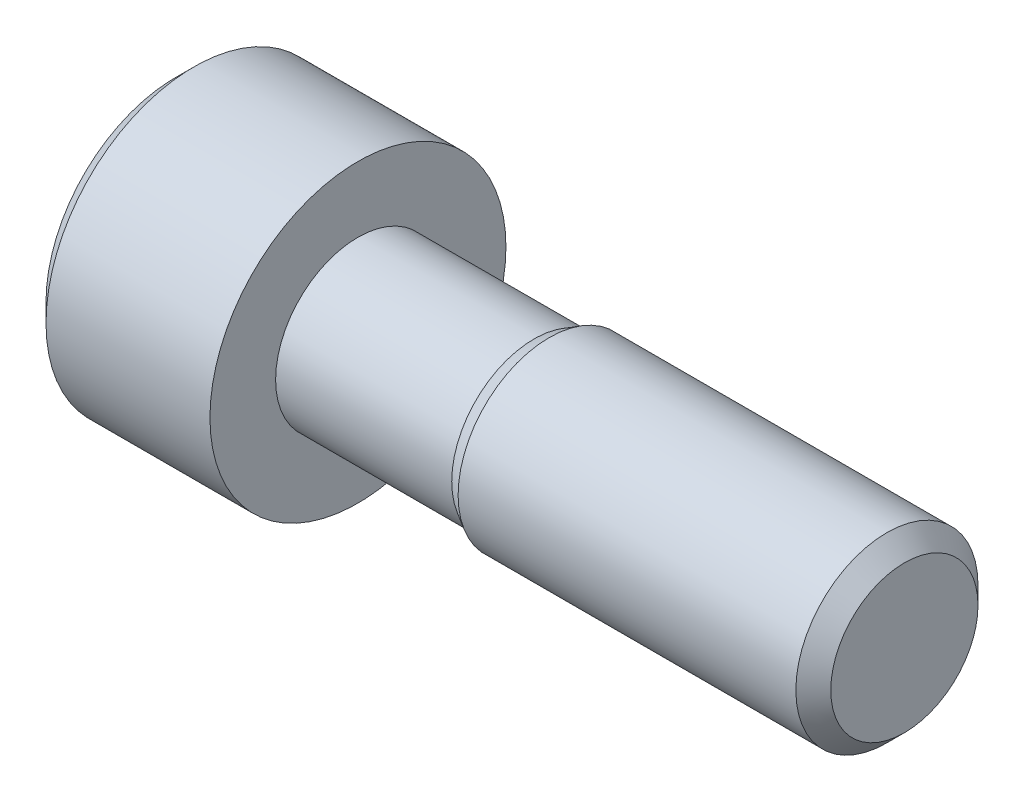
ISO-10303-21;
HEADER;
FILE_DESCRIPTION(('STEP AP214'),'2;1');
FILE_NAME('part.step','',(''),(''),'','','');
FILE_SCHEMA(('AUTOMOTIVE_DESIGN { 1 0 10303 214 1 1 1 1 }'));
ENDSEC;
DATA;
#1=APPLICATION_CONTEXT('core data for automotive mechanical design processes');
#2=APPLICATION_PROTOCOL_DEFINITION('international standard','automotive_design',2000,#1);
#3=PRODUCT_CONTEXT('',#1,'mechanical');
#4=PRODUCT('Part','Part','',(#3));
#5=PRODUCT_RELATED_PRODUCT_CATEGORY('part','',(#4));
#6=PRODUCT_DEFINITION_FORMATION('','',#4);
#7=PRODUCT_DEFINITION_CONTEXT('part definition',#1,'design');
#8=PRODUCT_DEFINITION('design','',#6,#7);
#9=PRODUCT_DEFINITION_SHAPE('','',#8);
#10=(LENGTH_UNIT() NAMED_UNIT(*) SI_UNIT(.MILLI.,.METRE.));
#11=(NAMED_UNIT(*) PLANE_ANGLE_UNIT() SI_UNIT($,.RADIAN.));
#12=(NAMED_UNIT(*) SI_UNIT($,.STERADIAN.) SOLID_ANGLE_UNIT());
#13=UNCERTAINTY_MEASURE_WITH_UNIT(LENGTH_MEASURE(1.E-05),#10,'distance_accuracy_value','');
#14=(GEOMETRIC_REPRESENTATION_CONTEXT(3) GLOBAL_UNCERTAINTY_ASSIGNED_CONTEXT((#13)) GLOBAL_UNIT_ASSIGNED_CONTEXT((#10,
#11,#12)) REPRESENTATION_CONTEXT('',''));
#15=CARTESIAN_POINT('',(0.,0.,0.));
#16=DIRECTION('',(0.,0.,1.));
#17=DIRECTION('',(1.,0.,0.));
#18=AXIS2_PLACEMENT_3D('',#15,#16,#17);
#19=CARTESIAN_POINT('',(-8.,-5.7,5.7));
#20=DIRECTION('',(-1.,0.,0.));
#21=DIRECTION('',(0.,1.,0.));
#22=AXIS2_PLACEMENT_3D('',#19,#20,#21);
#23=PLANE('',#22);
#24=CARTESIAN_POINT('',(-8.,0.,0.));
#25=DIRECTION('',(-1.,0.,0.));
#26=DIRECTION('',(0.,0.,-1.));
#27=AXIS2_PLACEMENT_3D('',#24,#25,#26);
#28=CIRCLE('',#27,5.7);
#29=CARTESIAN_POINT('',(-8.,0.,-5.7));
#30=VERTEX_POINT('',#29);
#31=EDGE_CURVE('E111',#30,#30,#28,.F.);
#32=ORIENTED_EDGE('',*,*,#31,.F.);
#33=EDGE_LOOP('',(#32));
#34=FACE_BOUND('',#33,.T.);
#35=DIRECTION('',(0.,0.500000000000001,-0.866025403784438));
#36=VECTOR('',#35,1.);
#37=CARTESIAN_POINT('',(-8.,-3.46410161513779,0.));
#38=LINE('',#37,#36);
#39=CARTESIAN_POINT('',(-8.,-1.7320508075689,-3.));
#40=VERTEX_POINT('',#39);
#41=CARTESIAN_POINT('',(-8.,-3.46410161513779,0.));
#42=VERTEX_POINT('',#41);
#43=EDGE_CURVE('E98',#40,#42,#38,.F.);
#44=ORIENTED_EDGE('',*,*,#43,.F.);
#45=DIRECTION('',(0.,1.,0.));
#46=VECTOR('',#45,1.);
#47=CARTESIAN_POINT('',(-8.,-1.7320508075689,-3.));
#48=LINE('',#47,#46);
#49=CARTESIAN_POINT('',(-8.,1.7320508075689,-3.));
#50=VERTEX_POINT('',#49);
#51=EDGE_CURVE('E87',#50,#40,#48,.F.);
#52=ORIENTED_EDGE('',*,*,#51,.F.);
#53=DIRECTION('',(0.,0.500000000000006,0.866025403784435));
#54=VECTOR('',#53,1.);
#55=CARTESIAN_POINT('',(-8.,1.7320508075689,-3.));
#56=LINE('',#55,#54);
#57=CARTESIAN_POINT('',(-8.,3.4641016151378,0.));
#58=VERTEX_POINT('',#57);
#59=EDGE_CURVE('E97',#58,#50,#56,.F.);
#60=ORIENTED_EDGE('',*,*,#59,.F.);
#61=DIRECTION('',(0.,-0.500000000000005,0.866025403784436));
#62=VECTOR('',#61,1.);
#63=CARTESIAN_POINT('',(-8.,3.4641016151378,0.));
#64=LINE('',#63,#62);
#65=CARTESIAN_POINT('',(-8.,1.7320508075689,3.));
#66=VERTEX_POINT('',#65);
#67=EDGE_CURVE('E121',#66,#58,#64,.F.);
#68=ORIENTED_EDGE('',*,*,#67,.F.);
#69=DIRECTION('',(0.,-1.,0.));
#70=VECTOR('',#69,1.);
#71=CARTESIAN_POINT('',(-8.,1.7320508075689,3.));
#72=LINE('',#71,#70);
#73=CARTESIAN_POINT('',(-8.,-1.7320508075689,3.));
#74=VERTEX_POINT('',#73);
#75=EDGE_CURVE('E125',#74,#66,#72,.F.);
#76=ORIENTED_EDGE('',*,*,#75,.F.);
#77=DIRECTION('',(0.,-0.500000000000001,-0.866025403784438));
#78=VECTOR('',#77,1.);
#79=CARTESIAN_POINT('',(-8.,-1.7320508075689,3.));
#80=LINE('',#79,#78);
#81=EDGE_CURVE('E110',#42,#74,#80,.F.);
#82=ORIENTED_EDGE('',*,*,#81,.F.);
#83=EDGE_LOOP('',(#44,#52,#60,#68,#76,#82));
#84=FACE_BOUND('',#83,.T.);
#85=ADVANCED_FACE('F17',(#34,#84),#23,.T.);
#86=CARTESIAN_POINT('',(24.,-3.233,-3.233));
#87=DIRECTION('',(1.,0.,0.));
#88=DIRECTION('',(0.,1.,0.));
#89=AXIS2_PLACEMENT_3D('',#86,#87,#88);
#90=PLANE('',#89);
#91=CARTESIAN_POINT('',(24.,0.,0.));
#92=DIRECTION('',(1.,0.,0.));
#93=DIRECTION('',(0.,0.,1.));
#94=AXIS2_PLACEMENT_3D('',#91,#92,#93);
#95=CIRCLE('',#94,3.233);
#96=CARTESIAN_POINT('',(24.,0.,3.233));
#97=VERTEX_POINT('',#96);
#98=EDGE_CURVE('E133',#97,#97,#95,.T.);
#99=ORIENTED_EDGE('',*,*,#98,.T.);
#100=EDGE_LOOP('',(#99));
#101=FACE_BOUND('',#100,.T.);
#102=ADVANCED_FACE('F285',(#101),#90,.T.);
#103=CARTESIAN_POINT('',(0.,-6.67760572478225,-6.5));
#104=DIRECTION('',(1.,0.,0.));
#105=DIRECTION('',(0.,1.,0.));
#106=AXIS2_PLACEMENT_3D('',#103,#104,#105);
#107=PLANE('',#106);
#108=CARTESIAN_POINT('',(0.,0.,0.));
#109=DIRECTION('',(1.,0.,0.));
#110=DIRECTION('',(0.,0.,1.));
#111=AXIS2_PLACEMENT_3D('',#108,#109,#110);
#112=CIRCLE('',#111,6.5);
#113=CARTESIAN_POINT('',(0.,0.,6.5));
#114=VERTEX_POINT('',#113);
#115=EDGE_CURVE('E138',#114,#114,#112,.T.);
#116=ORIENTED_EDGE('',*,*,#115,.T.);
#117=EDGE_LOOP('',(#116));
#118=FACE_BOUND('',#117,.T.);
#119=CARTESIAN_POINT('',(0.,0.,0.));
#120=DIRECTION('',(-1.,0.,0.));
#121=DIRECTION('',(0.,0.,-1.));
#122=AXIS2_PLACEMENT_3D('',#119,#120,#121);
#123=CIRCLE('',#122,3.61604075);
#124=CARTESIAN_POINT('',(0.,0.,-3.61604075));
#125=VERTEX_POINT('',#124);
#126=EDGE_CURVE('E141',#125,#125,#123,.F.);
#127=ORIENTED_EDGE('',*,*,#126,.F.);
#128=EDGE_LOOP('',(#127));
#129=FACE_BOUND('',#128,.T.);
#130=ADVANCED_FACE('F291',(#118,#129),#107,.T.);
#131=CARTESIAN_POINT('',(-4.,-2.59807621135334,-1.50000000000001));
#132=DIRECTION('',(-1.,0.,0.));
#133=DIRECTION('',(0.,1.,0.));
#134=AXIS2_PLACEMENT_3D('',#131,#132,#133);
#135=PLANE('',#134);
#136=DIRECTION('',(0.,-1.,0.));
#137=VECTOR('',#136,1.);
#138=CARTESIAN_POINT('',(-4.,0.,-3.));
#139=LINE('',#138,#137);
#140=CARTESIAN_POINT('',(-4.,-1.7320508075689,-3.));
#141=VERTEX_POINT('',#140);
#142=CARTESIAN_POINT('',(-4.,0.,-3.));
#143=VERTEX_POINT('',#142);
#144=EDGE_CURVE('E144',#141,#143,#139,.F.);
#145=ORIENTED_EDGE('',*,*,#144,.F.);
#146=DIRECTION('',(0.,-0.500000000000004,0.866025403784437));
#147=VECTOR('',#146,1.);
#148=CARTESIAN_POINT('',(-4.,-1.7320508075689,-3.));
#149=LINE('',#148,#147);
#150=CARTESIAN_POINT('',(-4.,-2.59807621135333,-1.50000000000003));
#151=VERTEX_POINT('',#150);
#152=EDGE_CURVE('E105',#151,#141,#149,.F.);
#153=ORIENTED_EDGE('',*,*,#152,.F.);
#154=CARTESIAN_POINT('',(-4.,0.,0.));
#155=DIRECTION('',(1.,0.,0.));
#156=DIRECTION('',(0.,-0.866025403784436,-0.500000000000005));
#157=AXIS2_PLACEMENT_3D('',#154,#155,#156);
#158=CIRCLE('',#157,3.00000000000004);
#159=EDGE_CURVE('E149',#151,#143,#158,.T.);
#160=ORIENTED_EDGE('',*,*,#159,.T.);
#161=EDGE_LOOP('',(#145,#153,#160));
#162=FACE_BOUND('',#161,.T.);
#163=ADVANCED_FACE('F298',(#162),#135,.T.);
#164=CARTESIAN_POINT('',(-4.,-3.4641016151378,1.50000000000002));
#165=DIRECTION('',(-1.,0.,0.));
#166=DIRECTION('',(0.,1.,0.));
#167=AXIS2_PLACEMENT_3D('',#164,#165,#166);
#168=PLANE('',#167);
#169=DIRECTION('',(0.,-0.500000000000003,0.866025403784437));
#170=VECTOR('',#169,1.);
#171=CARTESIAN_POINT('',(-4.,-2.59807621135333,-1.50000000000003));
#172=LINE('',#171,#170);
#173=CARTESIAN_POINT('',(-4.,-3.4641016151378,0.));
#174=VERTEX_POINT('',#173);
#175=EDGE_CURVE('E154',#174,#151,#172,.F.);
#176=ORIENTED_EDGE('',*,*,#175,.F.);
#177=DIRECTION('',(0.,0.500000000000009,0.866025403784433));
#178=VECTOR('',#177,1.);
#179=CARTESIAN_POINT('',(-4.,-3.4641016151378,0.));
#180=LINE('',#179,#178);
#181=CARTESIAN_POINT('',(-4.,-2.59807621135332,1.50000000000002));
#182=VERTEX_POINT('',#181);
#183=EDGE_CURVE('E158',#182,#174,#180,.F.);
#184=ORIENTED_EDGE('',*,*,#183,.F.);
#185=CARTESIAN_POINT('',(-4.,0.,0.));
#186=DIRECTION('',(1.,0.,0.));
#187=DIRECTION('',(0.,-0.866025403784436,0.500000000000005));
#188=AXIS2_PLACEMENT_3D('',#185,#186,#187);
#189=CIRCLE('',#188,3.00000000000004);
#190=EDGE_CURVE('E163',#182,#151,#189,.T.);
#191=ORIENTED_EDGE('',*,*,#190,.T.);
#192=EDGE_LOOP('',(#176,#184,#191));
#193=FACE_BOUND('',#192,.T.);
#194=ADVANCED_FACE('F302',(#193),#168,.T.);
#195=CARTESIAN_POINT('',(-4.,-2.59807621135332,3.));
#196=DIRECTION('',(-1.,0.,0.));
#197=DIRECTION('',(0.,1.,0.));
#198=AXIS2_PLACEMENT_3D('',#195,#196,#197);
#199=PLANE('',#198);
#200=DIRECTION('',(0.,0.5,0.866025403784439));
#201=VECTOR('',#200,1.);
#202=CARTESIAN_POINT('',(-4.,-2.59807621135332,1.50000000000002));
#203=LINE('',#202,#201);
#204=CARTESIAN_POINT('',(-4.,-1.7320508075689,3.));
#205=VERTEX_POINT('',#204);
#206=EDGE_CURVE('E168',#205,#182,#203,.F.);
#207=ORIENTED_EDGE('',*,*,#206,.F.);
#208=DIRECTION('',(0.,1.,0.));
#209=VECTOR('',#208,1.);
#210=CARTESIAN_POINT('',(-4.,-1.7320508075689,3.));
#211=LINE('',#210,#209);
#212=CARTESIAN_POINT('',(-4.,0.,3.));
#213=VERTEX_POINT('',#212);
#214=EDGE_CURVE('E172',#213,#205,#211,.F.);
#215=ORIENTED_EDGE('',*,*,#214,.F.);
#216=CARTESIAN_POINT('',(-4.,0.,0.));
#217=DIRECTION('',(1.,0.,0.));
#218=DIRECTION('',(0.,0.,1.));
#219=AXIS2_PLACEMENT_3D('',#216,#217,#218);
#220=CIRCLE('',#219,3.00000000000004);
#221=EDGE_CURVE('E177',#213,#182,#220,.T.);
#222=ORIENTED_EDGE('',*,*,#221,.T.);
#223=EDGE_LOOP('',(#207,#215,#222));
#224=FACE_BOUND('',#223,.T.);
#225=ADVANCED_FACE('F306',(#224),#199,.T.);
#226=CARTESIAN_POINT('',(-4.,0.,3.));
#227=DIRECTION('',(-1.,0.,0.));
#228=DIRECTION('',(0.,1.,0.));
#229=AXIS2_PLACEMENT_3D('',#226,#227,#228);
#230=PLANE('',#229);
#231=DIRECTION('',(0.,1.,0.));
#232=VECTOR('',#231,1.);
#233=CARTESIAN_POINT('',(-4.,0.,3.));
#234=LINE('',#233,#232);
#235=CARTESIAN_POINT('',(-4.,1.7320508075689,3.));
#236=VERTEX_POINT('',#235);
#237=EDGE_CURVE('E182',#236,#213,#234,.F.);
#238=ORIENTED_EDGE('',*,*,#237,.F.);
#239=DIRECTION('',(0.,0.500000000000004,-0.866025403784437));
#240=VECTOR('',#239,1.);
#241=CARTESIAN_POINT('',(-4.,1.7320508075689,3.));
#242=LINE('',#241,#240);
#243=CARTESIAN_POINT('',(-4.,2.59807621135333,1.50000000000003));
#244=VERTEX_POINT('',#243);
#245=EDGE_CURVE('E186',#244,#236,#242,.F.);
#246=ORIENTED_EDGE('',*,*,#245,.F.);
#247=CARTESIAN_POINT('',(-4.,0.,0.));
#248=DIRECTION('',(1.,0.,0.));
#249=DIRECTION('',(0.,0.866025403784436,0.500000000000005));
#250=AXIS2_PLACEMENT_3D('',#247,#248,#249);
#251=CIRCLE('',#250,3.00000000000004);
#252=EDGE_CURVE('E190',#244,#213,#251,.T.);
#253=ORIENTED_EDGE('',*,*,#252,.T.);
#254=EDGE_LOOP('',(#238,#246,#253));
#255=FACE_BOUND('',#254,.T.);
#256=ADVANCED_FACE('F310',(#255),#230,.T.);
#257=CARTESIAN_POINT('',(-4.,2.59807621135331,1.50000000000003));
#258=DIRECTION('',(-1.,0.,0.));
#259=DIRECTION('',(0.,1.,0.));
#260=AXIS2_PLACEMENT_3D('',#257,#258,#259);
#261=PLANE('',#260);
#262=DIRECTION('',(0.,0.500000000000003,-0.866025403784437));
#263=VECTOR('',#262,1.);
#264=CARTESIAN_POINT('',(-4.,2.59807621135333,1.50000000000003));
#265=LINE('',#264,#263);
#266=CARTESIAN_POINT('',(-4.,3.4641016151378,0.));
#267=VERTEX_POINT('',#266);
#268=EDGE_CURVE('E195',#267,#244,#265,.F.);
#269=ORIENTED_EDGE('',*,*,#268,.F.);
#270=DIRECTION('',(0.,-0.500000000000009,-0.866025403784433));
#271=VECTOR('',#270,1.);
#272=CARTESIAN_POINT('',(-4.,3.4641016151378,0.));
#273=LINE('',#272,#271);
#274=CARTESIAN_POINT('',(-4.,2.59807621135332,-1.50000000000002));
#275=VERTEX_POINT('',#274);
#276=EDGE_CURVE('E199',#275,#267,#273,.F.);
#277=ORIENTED_EDGE('',*,*,#276,.F.);
#278=CARTESIAN_POINT('',(-4.,0.,0.));
#279=DIRECTION('',(1.,0.,0.));
#280=DIRECTION('',(0.,0.866025403784436,-0.500000000000005));
#281=AXIS2_PLACEMENT_3D('',#278,#279,#280);
#282=CIRCLE('',#281,3.00000000000004);
#283=EDGE_CURVE('E204',#275,#244,#282,.T.);
#284=ORIENTED_EDGE('',*,*,#283,.T.);
#285=EDGE_LOOP('',(#269,#277,#284));
#286=FACE_BOUND('',#285,.T.);
#287=ADVANCED_FACE('F314',(#286),#261,.T.);
#288=CARTESIAN_POINT('',(-4.,0.,-1.50000000000002));
#289=DIRECTION('',(-1.,0.,0.));
#290=DIRECTION('',(0.,1.,0.));
#291=AXIS2_PLACEMENT_3D('',#288,#289,#290);
#292=PLANE('',#291);
#293=DIRECTION('',(0.,-0.5,-0.866025403784439));
#294=VECTOR('',#293,1.);
#295=CARTESIAN_POINT('',(-4.,2.59807621135333,-1.50000000000002));
#296=LINE('',#295,#294);
#297=CARTESIAN_POINT('',(-4.,1.7320508075689,-3.));
#298=VERTEX_POINT('',#297);
#299=EDGE_CURVE('E209',#298,#275,#296,.F.);
#300=ORIENTED_EDGE('',*,*,#299,.F.);
#301=DIRECTION('',(0.,-1.,0.));
#302=VECTOR('',#301,1.);
#303=CARTESIAN_POINT('',(-4.,1.7320508075689,-3.));
#304=LINE('',#303,#302);
#305=EDGE_CURVE('E213',#143,#298,#304,.F.);
#306=ORIENTED_EDGE('',*,*,#305,.F.);
#307=CARTESIAN_POINT('',(-4.,0.,0.));
#308=DIRECTION('',(1.,0.,0.));
#309=DIRECTION('',(0.,0.,-1.));
#310=AXIS2_PLACEMENT_3D('',#307,#308,#309);
#311=CIRCLE('',#310,3.00000000000004);
#312=EDGE_CURVE('E217',#143,#275,#311,.T.);
#313=ORIENTED_EDGE('',*,*,#312,.T.);
#314=EDGE_LOOP('',(#300,#306,#313));
#315=FACE_BOUND('',#314,.T.);
#316=ADVANCED_FACE('F318',(#315),#292,.T.);
#317=CARTESIAN_POINT('',(-4.,-1.7320508075689,3.));
#318=DIRECTION('',(0.,0.,-1.));
#319=DIRECTION('',(-1.,0.,0.));
#320=AXIS2_PLACEMENT_3D('',#317,#318,#319);
#321=PLANE('',#320);
#322=ORIENTED_EDGE('',*,*,#237,.T.);
#323=ORIENTED_EDGE('',*,*,#214,.T.);
#324=DIRECTION('',(-1.,0.,0.));
#325=VECTOR('',#324,1.);
#326=CARTESIAN_POINT('',(-4.,-1.7320508075689,3.));
#327=LINE('',#326,#325);
#328=EDGE_CURVE('E222',#205,#74,#327,.T.);
#329=ORIENTED_EDGE('',*,*,#328,.T.);
#330=ORIENTED_EDGE('',*,*,#75,.T.);
#331=DIRECTION('',(1.,0.,0.));
#332=VECTOR('',#331,1.);
#333=CARTESIAN_POINT('',(-8.,1.73205080756891,3.));
#334=LINE('',#333,#332);
#335=EDGE_CURVE('E227',#236,#66,#334,.F.);
#336=ORIENTED_EDGE('',*,*,#335,.F.);
#337=EDGE_LOOP('',(#322,#323,#329,#330,#336));
#338=FACE_BOUND('',#337,.T.);
#339=ADVANCED_FACE('F322',(#338),#321,.T.);
#340=CARTESIAN_POINT('',(-8.,-3.46410161513779,0.));
#341=DIRECTION('',(0.,0.866025403784438,-0.500000000000001));
#342=DIRECTION('',(0.,0.500000000000001,0.866025403784438));
#343=AXIS2_PLACEMENT_3D('',#340,#341,#342);
#344=PLANE('',#343);
#345=ORIENTED_EDGE('',*,*,#206,.T.);
#346=ORIENTED_EDGE('',*,*,#183,.T.);
#347=DIRECTION('',(-1.,0.,0.));
#348=VECTOR('',#347,1.);
#349=CARTESIAN_POINT('',(-4.,-3.46410161513779,0.));
#350=LINE('',#349,#348);
#351=EDGE_CURVE('E106',#174,#42,#350,.T.);
#352=ORIENTED_EDGE('',*,*,#351,.T.);
#353=ORIENTED_EDGE('',*,*,#81,.T.);
#354=ORIENTED_EDGE('',*,*,#328,.F.);
#355=EDGE_LOOP('',(#345,#346,#352,#353,#354));
#356=FACE_BOUND('',#355,.T.);
#357=ADVANCED_FACE('F326',(#356),#344,.T.);
#358=CARTESIAN_POINT('',(-8.,-1.73205080756891,-3.00000000000001));
#359=DIRECTION('',(0.,0.866025403784438,0.500000000000001));
#360=DIRECTION('',(0.,-0.500000000000001,0.866025403784438));
#361=AXIS2_PLACEMENT_3D('',#358,#359,#360);
#362=PLANE('',#361);
#363=ORIENTED_EDGE('',*,*,#175,.T.);
#364=ORIENTED_EDGE('',*,*,#152,.T.);
#365=DIRECTION('',(-1.,0.,0.));
#366=VECTOR('',#365,1.);
#367=CARTESIAN_POINT('',(-4.,-1.73205080756891,-3.00000000000001));
#368=LINE('',#367,#366);
#369=EDGE_CURVE('E91',#141,#40,#368,.T.);
#370=ORIENTED_EDGE('',*,*,#369,.T.);
#371=ORIENTED_EDGE('',*,*,#43,.T.);
#372=ORIENTED_EDGE('',*,*,#351,.F.);
#373=EDGE_LOOP('',(#363,#364,#370,#371,#372));
#374=FACE_BOUND('',#373,.T.);
#375=ADVANCED_FACE('F102',(#374),#362,.T.);
#376=CARTESIAN_POINT('',(-8.,-1.7320508075689,-3.));
#377=DIRECTION('',(0.,0.,1.));
#378=DIRECTION('',(1.,0.,0.));
#379=AXIS2_PLACEMENT_3D('',#376,#377,#378);
#380=PLANE('',#379);
#381=ORIENTED_EDGE('',*,*,#144,.T.);
#382=ORIENTED_EDGE('',*,*,#305,.T.);
#383=DIRECTION('',(-1.,0.,0.));
#384=VECTOR('',#383,1.);
#385=CARTESIAN_POINT('',(-4.,1.7320508075689,-3.));
#386=LINE('',#385,#384);
#387=EDGE_CURVE('E35',#298,#50,#386,.T.);
#388=ORIENTED_EDGE('',*,*,#387,.T.);
#389=ORIENTED_EDGE('',*,*,#51,.T.);
#390=ORIENTED_EDGE('',*,*,#369,.F.);
#391=EDGE_LOOP('',(#381,#382,#388,#389,#390));
#392=FACE_BOUND('',#391,.T.);
#393=ADVANCED_FACE('F90',(#392),#380,.T.);
#394=CARTESIAN_POINT('',(-8.,3.46410161513779,0.));
#395=DIRECTION('',(0.,-0.866025403784438,0.500000000000001));
#396=DIRECTION('',(0.,-0.500000000000001,-0.866025403784438));
#397=AXIS2_PLACEMENT_3D('',#394,#395,#396);
#398=PLANE('',#397);
#399=ORIENTED_EDGE('',*,*,#299,.T.);
#400=ORIENTED_EDGE('',*,*,#276,.T.);
#401=DIRECTION('',(-1.,0.,0.));
#402=VECTOR('',#401,1.);
#403=CARTESIAN_POINT('',(-4.,3.46410161513779,0.));
#404=LINE('',#403,#402);
#405=EDGE_CURVE('E239',#267,#58,#404,.T.);
#406=ORIENTED_EDGE('',*,*,#405,.T.);
#407=ORIENTED_EDGE('',*,*,#59,.T.);
#408=ORIENTED_EDGE('',*,*,#387,.F.);
#409=EDGE_LOOP('',(#399,#400,#406,#407,#408));
#410=FACE_BOUND('',#409,.T.);
#411=ADVANCED_FACE('F335',(#410),#398,.T.);
#412=CARTESIAN_POINT('',(-8.,1.73205080756891,3.00000000000001));
#413=DIRECTION('',(0.,-0.866025403784438,-0.500000000000001));
#414=DIRECTION('',(0.,0.500000000000001,-0.866025403784438));
#415=AXIS2_PLACEMENT_3D('',#412,#413,#414);
#416=PLANE('',#415);
#417=ORIENTED_EDGE('',*,*,#268,.T.);
#418=ORIENTED_EDGE('',*,*,#245,.T.);
#419=ORIENTED_EDGE('',*,*,#335,.T.);
#420=ORIENTED_EDGE('',*,*,#67,.T.);
#421=ORIENTED_EDGE('',*,*,#405,.F.);
#422=EDGE_LOOP('',(#417,#418,#419,#420,#421));
#423=FACE_BOUND('',#422,.T.);
#424=ADVANCED_FACE('F265',(#423),#416,.T.);
#425=CARTESIAN_POINT('',(8.4,0.,0.));
#426=DIRECTION('',(1.,0.,0.));
#427=DIRECTION('',(0.,1.92328497912594E-10,1.));
#428=AXIS2_PLACEMENT_3D('',#425,#426,#427);
#429=CONICAL_SURFACE('',#428,4.,0.523598775598308);
#430=CARTESIAN_POINT('',(8.4,0.,0.));
#431=DIRECTION('',(-1.,0.,0.));
#432=DIRECTION('',(0.,0.,-1.));
#433=AXIS2_PLACEMENT_3D('',#430,#431,#432);
#434=CIRCLE('',#433,4.);
#435=CARTESIAN_POINT('',(8.4,0.,-4.));
#436=VERTEX_POINT('',#435);
#437=EDGE_CURVE('E244',#436,#436,#434,.F.);
#438=ORIENTED_EDGE('',*,*,#437,.F.);
#439=EDGE_LOOP('',(#438));
#440=FACE_BOUND('',#439,.T.);
#441=CARTESIAN_POINT('',(7.73496307096397,0.,0.));
#442=DIRECTION('',(1.,0.,0.));
#443=DIRECTION('',(0.,0.,1.));
#444=AXIS2_PLACEMENT_3D('',#441,#442,#443);
#445=CIRCLE('',#444,3.61604075);
#446=CARTESIAN_POINT('',(7.73496307096397,0.,3.61604075));
#447=VERTEX_POINT('',#446);
#448=EDGE_CURVE('E249',#447,#447,#445,.F.);
#449=ORIENTED_EDGE('',*,*,#448,.F.);
#450=EDGE_LOOP('',(#449));
#451=FACE_BOUND('',#450,.T.);
#452=ADVANCED_FACE('F259',(#440,#451),#429,.T.);
#453=CARTESIAN_POINT('',(24.,0.,0.));
#454=DIRECTION('',(1.,0.,0.));
#455=DIRECTION('',(0.,7.69313624256337E-10,1.));
#456=AXIS2_PLACEMENT_3D('',#453,#454,#455);
#457=CYLINDRICAL_SURFACE('',#456,4.);
#458=CARTESIAN_POINT('',(23.233,0.,0.));
#459=DIRECTION('',(-1.,0.,0.));
#460=DIRECTION('',(0.,0.,-1.));
#461=AXIS2_PLACEMENT_3D('',#458,#459,#460);
#462=CIRCLE('',#461,4.);
#463=CARTESIAN_POINT('',(23.233,0.,-4.));
#464=VERTEX_POINT('',#463);
#465=EDGE_CURVE('E25',#464,#464,#462,.F.);
#466=ORIENTED_EDGE('',*,*,#465,.F.);
#467=EDGE_LOOP('',(#466));
#468=FACE_BOUND('',#467,.T.);
#469=ORIENTED_EDGE('',*,*,#437,.T.);
#470=EDGE_LOOP('',(#469));
#471=FACE_BOUND('',#470,.T.);
#472=ADVANCED_FACE('F256',(#468,#471),#457,.T.);
#473=CARTESIAN_POINT('',(23.233,0.,0.));
#474=DIRECTION('',(-1.,0.,0.));
#475=DIRECTION('',(0.,0.,-1.));
#476=AXIS2_PLACEMENT_3D('',#473,#474,#475);
#477=CONICAL_SURFACE('',#476,4.,0.785398163397447);
#478=ORIENTED_EDGE('',*,*,#98,.F.);
#479=EDGE_LOOP('',(#478));
#480=FACE_BOUND('',#479,.T.);
#481=ORIENTED_EDGE('',*,*,#465,.T.);
#482=EDGE_LOOP('',(#481));
#483=FACE_BOUND('',#482,.T.);
#484=ADVANCED_FACE('F254',(#480,#483),#477,.T.);
#485=CARTESIAN_POINT('',(8.4,0.,0.));
#486=DIRECTION('',(1.,0.,0.));
#487=DIRECTION('',(0.,1.4205388655409E-07,0.99999999999999));
#488=AXIS2_PLACEMENT_3D('',#485,#486,#487);
#489=CYLINDRICAL_SURFACE('',#488,3.61604075);
#490=ORIENTED_EDGE('',*,*,#126,.T.);
#491=EDGE_LOOP('',(#490));
#492=FACE_BOUND('',#491,.T.);
#493=ORIENTED_EDGE('',*,*,#448,.T.);
#494=EDGE_LOOP('',(#493));
#495=FACE_BOUND('',#494,.T.);
#496=ADVANCED_FACE('F269',(#492,#495),#489,.T.);
#497=CARTESIAN_POINT('',(-7.2,0.,0.));
#498=DIRECTION('',(1.,0.,0.));
#499=DIRECTION('',(0.,0.,1.));
#500=AXIS2_PLACEMENT_3D('',#497,#498,#499);
#501=CONICAL_SURFACE('',#500,6.5,0.78539816339745);
#502=CARTESIAN_POINT('',(-7.2,0.,0.));
#503=DIRECTION('',(-1.,0.,0.));
#504=DIRECTION('',(0.,0.,-1.));
#505=AXIS2_PLACEMENT_3D('',#502,#503,#504);
#506=CIRCLE('',#505,6.5);
#507=CARTESIAN_POINT('',(-7.2,0.,-6.5));
#508=VERTEX_POINT('',#507);
#509=EDGE_CURVE('E11',#508,#508,#506,.F.);
#510=ORIENTED_EDGE('',*,*,#509,.F.);
#511=EDGE_LOOP('',(#510));
#512=FACE_BOUND('',#511,.T.);
#513=ORIENTED_EDGE('',*,*,#31,.T.);
#514=EDGE_LOOP('',(#513));
#515=FACE_BOUND('',#514,.T.);
#516=ADVANCED_FACE('F271',(#512,#515),#501,.T.);
#517=CARTESIAN_POINT('',(8.4,0.,0.));
#518=DIRECTION('',(1.,0.,0.));
#519=DIRECTION('',(0.,0.,1.));
#520=AXIS2_PLACEMENT_3D('',#517,#518,#519);
#521=CYLINDRICAL_SURFACE('',#520,6.5);
#522=ORIENTED_EDGE('',*,*,#115,.F.);
#523=EDGE_LOOP('',(#522));
#524=FACE_BOUND('',#523,.T.);
#525=ORIENTED_EDGE('',*,*,#509,.T.);
#526=EDGE_LOOP('',(#525));
#527=FACE_BOUND('',#526,.T.);
#528=ADVANCED_FACE('F279',(#524,#527),#521,.T.);
#529=CARTESIAN_POINT('',(-4.,0.,0.));
#530=DIRECTION('',(-1.,0.,0.));
#531=DIRECTION('',(0.,0.,-1.));
#532=AXIS2_PLACEMENT_3D('',#529,#530,#531);
#533=CONICAL_SURFACE('',#532,3.00000000000003,1.0471975511966);
#534=ORIENTED_EDGE('',*,*,#159,.F.);
#535=ORIENTED_EDGE('',*,*,#190,.F.);
#536=ORIENTED_EDGE('',*,*,#221,.F.);
#537=ORIENTED_EDGE('',*,*,#252,.F.);
#538=ORIENTED_EDGE('',*,*,#283,.F.);
#539=ORIENTED_EDGE('',*,*,#312,.F.);
#540=EDGE_LOOP('',(#534,#535,#536,#537,#538,#539));
#541=FACE_BOUND('',#540,.T.);
#542=CARTESIAN_POINT('',(-2.2679491924311,0.,0.));
#543=VERTEX_POINT('',#542);
#544=VERTEX_LOOP('',#543);
#545=FACE_BOUND('',#544,.T.);
#546=ADVANCED_FACE('F19',(#541,#545),#533,.F.);
#547=CLOSED_SHELL('',(#85,#102,#130,#163,#194,#225,#256,#287,#316,#339,#357,#375,#393,#411,#424,
#452,#472,#484,#496,#516,#528,#546));
#548=MANIFOLD_SOLID_BREP('B1',#547);
#549=ADVANCED_BREP_SHAPE_REPRESENTATION('',(#18,#548),#14);
#550=SHAPE_DEFINITION_REPRESENTATION(#9,#549);
ENDSEC;
END-ISO-10303-21;
